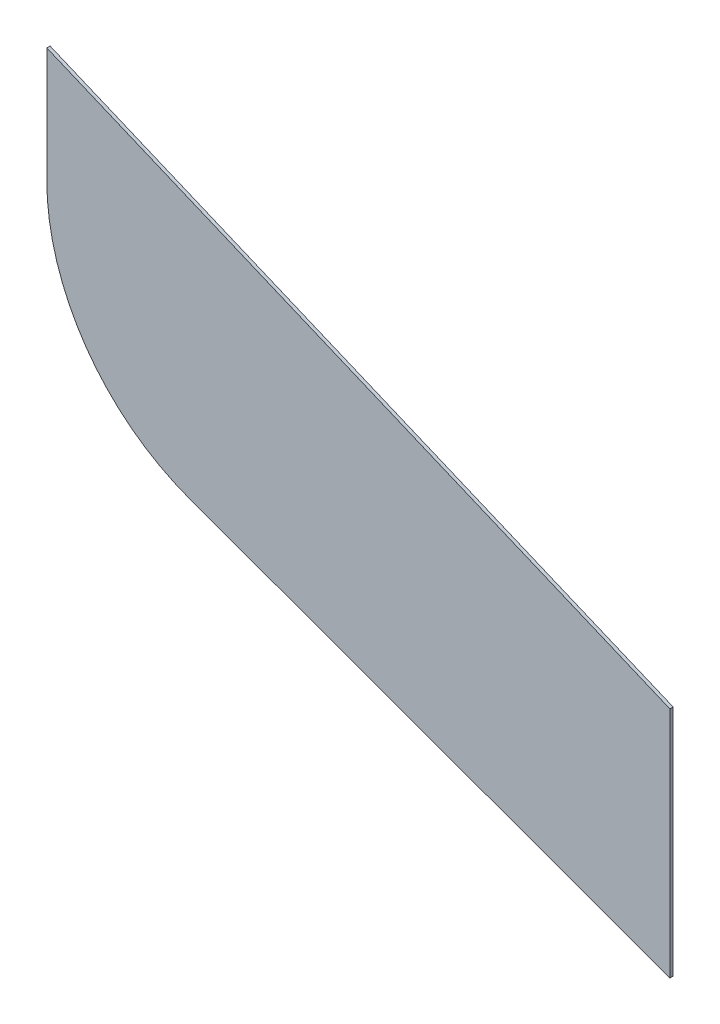
ISO-10303-21;
HEADER;
FILE_DESCRIPTION(('STEP AP214'),'2;1');
FILE_NAME('part.step','',(''),(''),'','','');
FILE_SCHEMA(('AUTOMOTIVE_DESIGN { 1 0 10303 214 1 1 1 1 }'));
ENDSEC;
DATA;
#1=APPLICATION_CONTEXT('core data for automotive mechanical design processes');
#2=APPLICATION_PROTOCOL_DEFINITION('international standard','automotive_design',2000,#1);
#3=PRODUCT_CONTEXT('',#1,'mechanical');
#4=PRODUCT('Part','Part','',(#3));
#5=PRODUCT_RELATED_PRODUCT_CATEGORY('part','',(#4));
#6=PRODUCT_DEFINITION_FORMATION('','',#4);
#7=PRODUCT_DEFINITION_CONTEXT('part definition',#1,'design');
#8=PRODUCT_DEFINITION('design','',#6,#7);
#9=PRODUCT_DEFINITION_SHAPE('','',#8);
#10=(LENGTH_UNIT() NAMED_UNIT(*) SI_UNIT(.MILLI.,.METRE.));
#11=(NAMED_UNIT(*) PLANE_ANGLE_UNIT() SI_UNIT($,.RADIAN.));
#12=(NAMED_UNIT(*) SI_UNIT($,.STERADIAN.) SOLID_ANGLE_UNIT());
#13=UNCERTAINTY_MEASURE_WITH_UNIT(LENGTH_MEASURE(1.E-05),#10,'distance_accuracy_value','');
#14=(GEOMETRIC_REPRESENTATION_CONTEXT(3) GLOBAL_UNCERTAINTY_ASSIGNED_CONTEXT((#13)) GLOBAL_UNIT_ASSIGNED_CONTEXT((#10,
#11,#12)) REPRESENTATION_CONTEXT('',''));
#15=CARTESIAN_POINT('',(0.,0.,0.));
#16=DIRECTION('',(0.,0.,1.));
#17=DIRECTION('',(1.,0.,0.));
#18=AXIS2_PLACEMENT_3D('',#15,#16,#17);
#19=CARTESIAN_POINT('',(2.743367730433,-2.452382612697,0.));
#20=DIRECTION('',(0.386210432787191,0.922410701155581,0.));
#21=DIRECTION('',(-0.922410701155581,0.386210432787191,0.));
#22=AXIS2_PLACEMENT_3D('',#19,#20,#21);
#23=PLANE('',#22);
#24=DIRECTION('',(-0.922410701155581,0.386210432787191,0.));
#25=VECTOR('',#24,1.);
#26=CARTESIAN_POINT('',(2.743367730433,-2.452382612697,0.));
#27=LINE('',#26,#25);
#28=CARTESIAN_POINT('',(2.743367730433,-2.452382612697,0.));
#29=VERTEX_POINT('',#28);
#30=CARTESIAN_POINT('',(2.170196909422,-2.212397809218,0.));
#31=VERTEX_POINT('',#30);
#32=EDGE_CURVE('E11',#29,#31,#27,.T.);
#33=ORIENTED_EDGE('',*,*,#32,.T.);
#34=DIRECTION('',(0.,0.,1.));
#35=VECTOR('',#34,1.);
#36=CARTESIAN_POINT('',(2.170196909422,-2.212397809218,0.));
#37=LINE('',#36,#35);
#38=CARTESIAN_POINT('',(2.170196909422,-2.212397809218,0.003));
#39=VERTEX_POINT('',#38);
#40=EDGE_CURVE('E24',#31,#39,#37,.T.);
#41=ORIENTED_EDGE('',*,*,#40,.T.);
#42=DIRECTION('',(-0.922410701155581,0.386210432787191,0.));
#43=VECTOR('',#42,1.);
#44=CARTESIAN_POINT('',(2.743367730433,-2.452382612697,0.003));
#45=LINE('',#44,#43);
#46=CARTESIAN_POINT('',(2.743367730433,-2.452382612697,0.003));
#47=VERTEX_POINT('',#46);
#48=EDGE_CURVE('E82',#47,#39,#45,.T.);
#49=ORIENTED_EDGE('',*,*,#48,.F.);
#50=DIRECTION('',(0.,0.,1.));
#51=VECTOR('',#50,1.);
#52=CARTESIAN_POINT('',(2.743367730433,-2.452382612697,0.));
#53=LINE('',#52,#51);
#54=EDGE_CURVE('E101',#29,#47,#53,.T.);
#55=ORIENTED_EDGE('',*,*,#54,.F.);
#56=EDGE_LOOP('',(#33,#41,#49,#55));
#57=FACE_BOUND('',#56,.T.);
#58=ADVANCED_FACE('F17',(#57),#23,.T.);
#59=CARTESIAN_POINT('',(2.743367730433,-2.666735077685,0.));
#60=DIRECTION('',(1.,0.,0.));
#61=DIRECTION('',(0.,1.,0.));
#62=AXIS2_PLACEMENT_3D('',#59,#60,#61);
#63=PLANE('',#62);
#64=DIRECTION('',(0.,1.,0.));
#65=VECTOR('',#64,1.);
#66=CARTESIAN_POINT('',(2.743367730433,-2.666735077685,0.));
#67=LINE('',#66,#65);
#68=CARTESIAN_POINT('',(2.743367730433,-2.666735077685,0.));
#69=VERTEX_POINT('',#68);
#70=EDGE_CURVE('E98',#69,#29,#67,.T.);
#71=ORIENTED_EDGE('',*,*,#70,.T.);
#72=ORIENTED_EDGE('',*,*,#54,.T.);
#73=DIRECTION('',(0.,1.,0.));
#74=VECTOR('',#73,1.);
#75=CARTESIAN_POINT('',(2.743367730433,-2.666735077685,0.003));
#76=LINE('',#75,#74);
#77=CARTESIAN_POINT('',(2.743367730433,-2.666735077685,0.003));
#78=VERTEX_POINT('',#77);
#79=EDGE_CURVE('E96',#78,#47,#76,.T.);
#80=ORIENTED_EDGE('',*,*,#79,.F.);
#81=DIRECTION('',(0.,0.,1.));
#82=VECTOR('',#81,1.);
#83=CARTESIAN_POINT('',(2.743367730433,-2.666735077685,0.));
#84=LINE('',#83,#82);
#85=EDGE_CURVE('E93',#69,#78,#84,.T.);
#86=ORIENTED_EDGE('',*,*,#85,.F.);
#87=EDGE_LOOP('',(#71,#72,#80,#86));
#88=FACE_BOUND('',#87,.T.);
#89=ADVANCED_FACE('F109',(#88),#63,.T.);
#90=CARTESIAN_POINT('',(2.301792880757,-2.506014976202,0.));
#91=DIRECTION('',(-0.342020143325668,-0.939692620785909,0.));
#92=DIRECTION('',(0.939692620785909,-0.342020143325668,0.));
#93=AXIS2_PLACEMENT_3D('',#90,#91,#92);
#94=PLANE('',#93);
#95=DIRECTION('',(0.939692620785909,-0.342020143325668,0.));
#96=VECTOR('',#95,1.);
#97=CARTESIAN_POINT('',(2.301792880757,-2.506014976202,0.));
#98=LINE('',#97,#96);
#99=CARTESIAN_POINT('',(2.301792880757,-2.506014976202,0.));
#100=VERTEX_POINT('',#99);
#101=EDGE_CURVE('E90',#100,#69,#98,.T.);
#102=ORIENTED_EDGE('',*,*,#101,.T.);
#103=ORIENTED_EDGE('',*,*,#85,.T.);
#104=DIRECTION('',(0.939692620785909,-0.342020143325668,0.));
#105=VECTOR('',#104,1.);
#106=CARTESIAN_POINT('',(2.301792880757,-2.506014976202,0.003));
#107=LINE('',#106,#105);
#108=CARTESIAN_POINT('',(2.301792880757,-2.506014976202,0.003));
#109=VERTEX_POINT('',#108);
#110=EDGE_CURVE('E88',#109,#78,#107,.T.);
#111=ORIENTED_EDGE('',*,*,#110,.F.);
#112=DIRECTION('',(0.,0.,1.));
#113=VECTOR('',#112,1.);
#114=CARTESIAN_POINT('',(2.301792880757,-2.506014976202,0.));
#115=LINE('',#114,#113);
#116=EDGE_CURVE('E67',#100,#109,#115,.T.);
#117=ORIENTED_EDGE('',*,*,#116,.F.);
#118=EDGE_LOOP('',(#102,#103,#111,#117));
#119=FACE_BOUND('',#118,.T.);
#120=ADVANCED_FACE('F107',(#119),#94,.T.);
#121=CARTESIAN_POINT('',(2.370196909422,-2.318076452045,0.));
#122=DIRECTION('',(0.,0.,1.));
#123=DIRECTION('',(-1.,0.,0.));
#124=AXIS2_PLACEMENT_3D('',#121,#122,#123);
#125=CYLINDRICAL_SURFACE('',#124,0.2);
#126=CARTESIAN_POINT('',(2.370196909422,-2.318076452045,0.));
#127=DIRECTION('',(0.,0.,1.));
#128=DIRECTION('',(-1.,0.,0.));
#129=AXIS2_PLACEMENT_3D('',#126,#127,#128);
#130=CIRCLE('',#129,0.2);
#131=CARTESIAN_POINT('',(2.170196909422,-2.318076452045,0.));
#132=VERTEX_POINT('',#131);
#133=EDGE_CURVE('E71',#132,#100,#130,.T.);
#134=ORIENTED_EDGE('',*,*,#133,.T.);
#135=ORIENTED_EDGE('',*,*,#116,.T.);
#136=CARTESIAN_POINT('',(2.370196909422,-2.318076452045,0.003));
#137=DIRECTION('',(0.,0.,1.));
#138=DIRECTION('',(-1.,0.,0.));
#139=AXIS2_PLACEMENT_3D('',#136,#137,#138);
#140=CIRCLE('',#139,0.2);
#141=CARTESIAN_POINT('',(2.170196909422,-2.318076452045,0.003));
#142=VERTEX_POINT('',#141);
#143=EDGE_CURVE('E60',#142,#109,#140,.T.);
#144=ORIENTED_EDGE('',*,*,#143,.F.);
#145=DIRECTION('',(0.,0.,1.));
#146=VECTOR('',#145,1.);
#147=CARTESIAN_POINT('',(2.170196909422,-2.318076452045,0.));
#148=LINE('',#147,#146);
#149=EDGE_CURVE('E64',#132,#142,#148,.T.);
#150=ORIENTED_EDGE('',*,*,#149,.F.);
#151=EDGE_LOOP('',(#134,#135,#144,#150));
#152=FACE_BOUND('',#151,.T.);
#153=ADVANCED_FACE('F63',(#152),#125,.T.);
#154=CARTESIAN_POINT('',(2.170196909422,-2.212397809218,0.));
#155=DIRECTION('',(-1.,0.,0.));
#156=DIRECTION('',(0.,-1.,0.));
#157=AXIS2_PLACEMENT_3D('',#154,#155,#156);
#158=PLANE('',#157);
#159=DIRECTION('',(0.,-1.,0.));
#160=VECTOR('',#159,1.);
#161=CARTESIAN_POINT('',(2.170196909422,-2.212397809218,0.));
#162=LINE('',#161,#160);
#163=EDGE_CURVE('E77',#31,#132,#162,.T.);
#164=ORIENTED_EDGE('',*,*,#163,.T.);
#165=ORIENTED_EDGE('',*,*,#149,.T.);
#166=DIRECTION('',(0.,-1.,0.));
#167=VECTOR('',#166,1.);
#168=CARTESIAN_POINT('',(2.170196909422,-2.212397809218,0.003));
#169=LINE('',#168,#167);
#170=EDGE_CURVE('E76',#39,#142,#169,.T.);
#171=ORIENTED_EDGE('',*,*,#170,.F.);
#172=ORIENTED_EDGE('',*,*,#40,.F.);
#173=EDGE_LOOP('',(#164,#165,#171,#172));
#174=FACE_BOUND('',#173,.T.);
#175=ADVANCED_FACE('F75',(#174),#158,.T.);
#176=CARTESIAN_POINT('',(2.456782319927,-2.439566443451,0.003));
#177=DIRECTION('',(0.,0.,1.));
#178=DIRECTION('',(1.,0.,0.));
#179=AXIS2_PLACEMENT_3D('',#176,#177,#178);
#180=PLANE('',#179);
#181=ORIENTED_EDGE('',*,*,#170,.T.);
#182=ORIENTED_EDGE('',*,*,#143,.T.);
#183=ORIENTED_EDGE('',*,*,#110,.T.);
#184=ORIENTED_EDGE('',*,*,#79,.T.);
#185=ORIENTED_EDGE('',*,*,#48,.T.);
#186=EDGE_LOOP('',(#181,#182,#183,#184,#185));
#187=FACE_BOUND('',#186,.T.);
#188=ADVANCED_FACE('F80',(#187),#180,.T.);
#189=CARTESIAN_POINT('',(2.456782319927,-2.439566443451,0.));
#190=DIRECTION('',(0.,0.,1.));
#191=DIRECTION('',(1.,0.,0.));
#192=AXIS2_PLACEMENT_3D('',#189,#190,#191);
#193=PLANE('',#192);
#194=ORIENTED_EDGE('',*,*,#163,.F.);
#195=ORIENTED_EDGE('',*,*,#32,.F.);
#196=ORIENTED_EDGE('',*,*,#70,.F.);
#197=ORIENTED_EDGE('',*,*,#101,.F.);
#198=ORIENTED_EDGE('',*,*,#133,.F.);
#199=EDGE_LOOP('',(#194,#195,#196,#197,#198));
#200=FACE_BOUND('',#199,.T.);
#201=ADVANCED_FACE('F104',(#200),#193,.F.);
#202=CLOSED_SHELL('',(#58,#89,#120,#153,#175,#188,#201));
#203=MANIFOLD_SOLID_BREP('B1',#202);
#204=ADVANCED_BREP_SHAPE_REPRESENTATION('',(#18,#203),#14);
#205=SHAPE_DEFINITION_REPRESENTATION(#9,#204);
ENDSEC;
END-ISO-10303-21;
